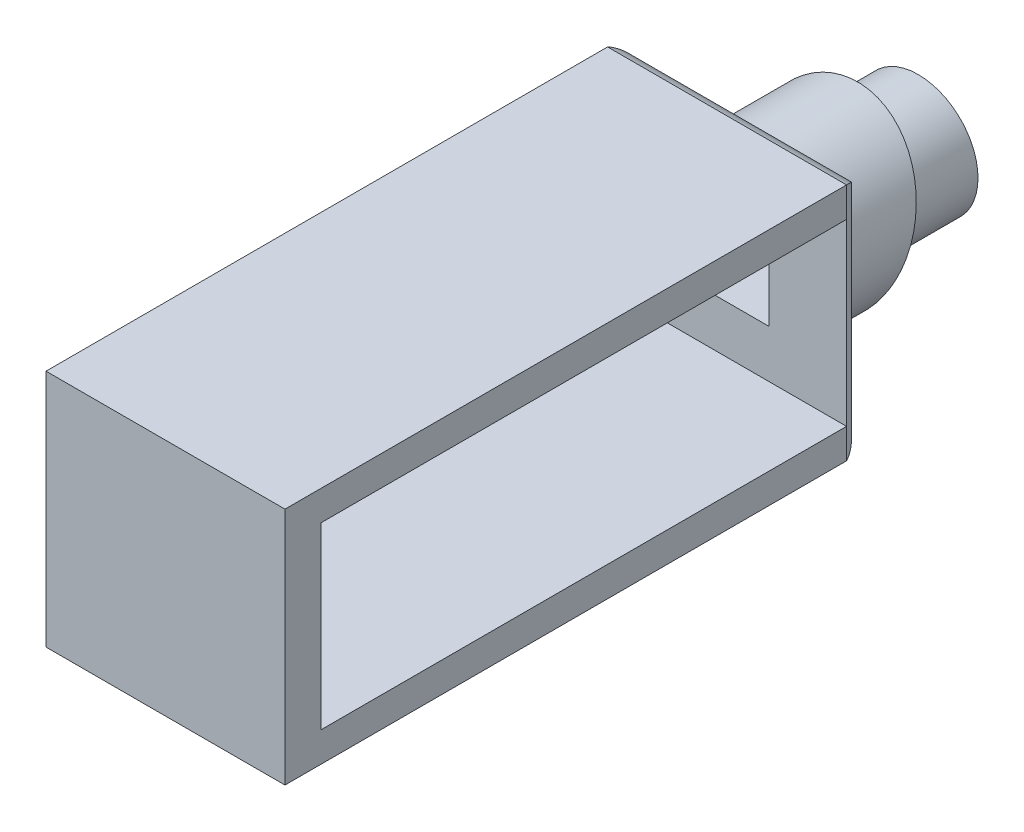
ISO-10303-21;
HEADER;
FILE_DESCRIPTION(('STEP AP214'),'2;1');
FILE_NAME('part.step','',(''),(''),'','','');
FILE_SCHEMA(('AUTOMOTIVE_DESIGN { 1 0 10303 214 1 1 1 1 }'));
ENDSEC;
DATA;
#1=APPLICATION_CONTEXT('core data for automotive mechanical design processes');
#2=APPLICATION_PROTOCOL_DEFINITION('international standard','automotive_design',2000,#1);
#3=PRODUCT_CONTEXT('',#1,'mechanical');
#4=PRODUCT('Part','Part','',(#3));
#5=PRODUCT_RELATED_PRODUCT_CATEGORY('part','',(#4));
#6=PRODUCT_DEFINITION_FORMATION('','',#4);
#7=PRODUCT_DEFINITION_CONTEXT('part definition',#1,'design');
#8=PRODUCT_DEFINITION('design','',#6,#7);
#9=PRODUCT_DEFINITION_SHAPE('','',#8);
#10=(LENGTH_UNIT() NAMED_UNIT(*) SI_UNIT(.MILLI.,.METRE.));
#11=(NAMED_UNIT(*) PLANE_ANGLE_UNIT() SI_UNIT($,.RADIAN.));
#12=(NAMED_UNIT(*) SI_UNIT($,.STERADIAN.) SOLID_ANGLE_UNIT());
#13=UNCERTAINTY_MEASURE_WITH_UNIT(LENGTH_MEASURE(1.E-05),#10,'distance_accuracy_value','');
#14=(GEOMETRIC_REPRESENTATION_CONTEXT(3) GLOBAL_UNCERTAINTY_ASSIGNED_CONTEXT((#13)) GLOBAL_UNIT_ASSIGNED_CONTEXT((#10,
#11,#12)) REPRESENTATION_CONTEXT('',''));
#15=CARTESIAN_POINT('',(0.,0.,0.));
#16=DIRECTION('',(0.,0.,1.));
#17=DIRECTION('',(1.,0.,0.));
#18=AXIS2_PLACEMENT_3D('',#15,#16,#17);
#19=CARTESIAN_POINT('',(0.,0.,0.));
#20=DIRECTION('',(0.,0.,1.));
#21=DIRECTION('',(1.,0.,0.));
#22=AXIS2_PLACEMENT_3D('',#19,#20,#21);
#23=PLANE('',#22);
#24=CARTESIAN_POINT('',(0.,0.,0.));
#25=DIRECTION('',(0.,0.,1.));
#26=DIRECTION('',(1.,0.,0.));
#27=AXIS2_PLACEMENT_3D('',#24,#25,#26);
#28=CIRCLE('',#27,2.5);
#29=CARTESIAN_POINT('',(2.5,0.,0.));
#30=VERTEX_POINT('',#29);
#31=EDGE_CURVE('E262',#30,#30,#28,.T.);
#32=ORIENTED_EDGE('',*,*,#31,.F.);
#33=EDGE_LOOP('',(#32));
#34=FACE_BOUND('',#33,.T.);
#35=CARTESIAN_POINT('',(0.,0.,0.));
#36=DIRECTION('',(0.,0.,1.));
#37=DIRECTION('',(1.,0.,0.));
#38=AXIS2_PLACEMENT_3D('',#35,#36,#37);
#39=CIRCLE('',#38,1.8);
#40=CARTESIAN_POINT('',(1.8,0.,0.));
#41=VERTEX_POINT('',#40);
#42=EDGE_CURVE('E259',#41,#41,#39,.T.);
#43=ORIENTED_EDGE('',*,*,#42,.T.);
#44=EDGE_LOOP('',(#43));
#45=FACE_BOUND('',#44,.T.);
#46=ADVANCED_FACE('F33',(#34,#45),#23,.F.);
#47=CARTESIAN_POINT('',(0.,0.,7.));
#48=DIRECTION('',(0.,0.,-1.));
#49=DIRECTION('',(-1.,0.,0.));
#50=AXIS2_PLACEMENT_3D('',#47,#48,#49);
#51=CYLINDRICAL_SURFACE('',#50,2.5);
#52=CARTESIAN_POINT('',(0.,0.,3.80746668257225));
#53=DIRECTION('',(0.,-0.342020143325676,-0.939692620785906));
#54=DIRECTION('',(0.,0.939692620785906,-0.342020143325676));
#55=AXIS2_PLACEMENT_3D('',#52,#53,#54);
#56=ELLIPSE('',#55,2.66044443118979,2.5);
#57=CARTESIAN_POINT('',(0.,2.5,2.89754109690673));
#58=VERTEX_POINT('',#57);
#59=EDGE_CURVE('E256',#58,#58,#56,.T.);
#60=ORIENTED_EDGE('',*,*,#59,.T.);
#61=EDGE_LOOP('',(#60));
#62=FACE_BOUND('',#61,.T.);
#63=ORIENTED_EDGE('',*,*,#31,.T.);
#64=EDGE_LOOP('',(#63));
#65=FACE_BOUND('',#64,.T.);
#66=ADVANCED_FACE('F315',(#62,#65),#51,.T.);
#67=CARTESIAN_POINT('',(0.,0.,7.));
#68=DIRECTION('',(0.,0.,-1.));
#69=DIRECTION('',(-1.,0.,0.));
#70=AXIS2_PLACEMENT_3D('',#67,#68,#69);
#71=CYLINDRICAL_SURFACE('',#70,1.8);
#72=CARTESIAN_POINT('',(0.,0.,3.80746668257225));
#73=DIRECTION('',(0.,-0.342020143325676,-0.939692620785906));
#74=DIRECTION('',(0.,0.939692620785906,-0.342020143325676));
#75=AXIS2_PLACEMENT_3D('',#72,#73,#74);
#76=ELLIPSE('',#75,1.91551999045665,1.8);
#77=CARTESIAN_POINT('',(0.,1.8,3.15232026089308));
#78=VERTEX_POINT('',#77);
#79=EDGE_CURVE('E265',#78,#78,#76,.T.);
#80=ORIENTED_EDGE('',*,*,#79,.F.);
#81=EDGE_LOOP('',(#80));
#82=FACE_BOUND('',#81,.T.);
#83=ORIENTED_EDGE('',*,*,#42,.F.);
#84=EDGE_LOOP('',(#83));
#85=FACE_BOUND('',#84,.T.);
#86=ADVANCED_FACE('F321',(#82,#85),#71,.F.);
#87=CARTESIAN_POINT('',(0.,0.,-6.40969202087358));
#88=DIRECTION('',(0.,0.,1.));
#89=DIRECTION('',(1.,0.,0.));
#90=AXIS2_PLACEMENT_3D('',#87,#88,#89);
#91=CYLINDRICAL_SURFACE('',#90,1.6);
#92=CARTESIAN_POINT('',(0.,0.,5.));
#93=DIRECTION('',(0.,0.,-1.));
#94=DIRECTION('',(-1.,0.,0.));
#95=AXIS2_PLACEMENT_3D('',#92,#93,#94);
#96=CIRCLE('',#95,1.6);
#97=CARTESIAN_POINT('',(-1.6,0.,5.));
#98=VERTEX_POINT('',#97);
#99=EDGE_CURVE('E37',#98,#98,#96,.F.);
#100=ORIENTED_EDGE('',*,*,#99,.T.);
#101=EDGE_LOOP('',(#100));
#102=FACE_BOUND('',#101,.T.);
#103=CARTESIAN_POINT('',(0.,0.,3.80746668257226));
#104=DIRECTION('',(0.,-0.342020143325676,-0.939692620785906));
#105=DIRECTION('',(0.,-0.939692620785906,0.342020143325676));
#106=AXIS2_PLACEMENT_3D('',#103,#104,#105);
#107=ELLIPSE('',#106,1.70268443596146,1.6);
#108=CARTESIAN_POINT('',(0.,-1.6,4.38981905739819));
#109=VERTEX_POINT('',#108);
#110=EDGE_CURVE('E251',#109,#109,#107,.F.);
#111=ORIENTED_EDGE('',*,*,#110,.F.);
#112=EDGE_LOOP('',(#111));
#113=FACE_BOUND('',#112,.T.);
#114=ADVANCED_FACE('F357',(#102,#113),#91,.F.);
#115=CARTESIAN_POINT('',(0.,1.2236962039259,3.36207768855867));
#116=DIRECTION('',(0.,-0.342020143325676,-0.939692620785906));
#117=DIRECTION('',(0.,0.939692620785906,-0.342020143325676));
#118=AXIS2_PLACEMENT_3D('',#115,#116,#117);
#119=PLANE('',#118);
#120=ORIENTED_EDGE('',*,*,#110,.T.);
#121=EDGE_LOOP('',(#120));
#122=FACE_BOUND('',#121,.T.);
#123=ORIENTED_EDGE('',*,*,#79,.T.);
#124=EDGE_LOOP('',(#123));
#125=FACE_BOUND('',#124,.T.);
#126=ADVANCED_FACE('F355',(#122,#125),#119,.T.);
#127=CARTESIAN_POINT('',(0.,0.,-6.40969202087358));
#128=DIRECTION('',(0.,0.,1.));
#129=DIRECTION('',(1.,0.,0.));
#130=AXIS2_PLACEMENT_3D('',#127,#128,#129);
#131=CYLINDRICAL_SURFACE('',#130,3.5);
#132=CARTESIAN_POINT('',(0.,0.,7.));
#133=DIRECTION('',(0.,0.,1.));
#134=DIRECTION('',(1.,0.,0.));
#135=AXIS2_PLACEMENT_3D('',#132,#133,#134);
#136=CIRCLE('',#135,3.5);
#137=CARTESIAN_POINT('',(3.5,0.,7.));
#138=VERTEX_POINT('',#137);
#139=EDGE_CURVE('E248',#138,#138,#136,.T.);
#140=ORIENTED_EDGE('',*,*,#139,.F.);
#141=EDGE_LOOP('',(#140));
#142=FACE_BOUND('',#141,.T.);
#143=CARTESIAN_POINT('',(0.,0.,3.80746668257226));
#144=DIRECTION('',(0.,-0.342020143325676,-0.939692620785906));
#145=DIRECTION('',(0.,-0.939692620785906,0.342020143325676));
#146=AXIS2_PLACEMENT_3D('',#143,#144,#145);
#147=ELLIPSE('',#146,3.7246222036657,3.5);
#148=CARTESIAN_POINT('',(0.,-3.5,5.08136250250399));
#149=VERTEX_POINT('',#148);
#150=EDGE_CURVE('E247',#149,#149,#147,.F.);
#151=ORIENTED_EDGE('',*,*,#150,.T.);
#152=EDGE_LOOP('',(#151));
#153=FACE_BOUND('',#152,.T.);
#154=ADVANCED_FACE('F352',(#142,#153),#131,.T.);
#155=ORIENTED_EDGE('',*,*,#59,.F.);
#156=EDGE_LOOP('',(#155));
#157=FACE_BOUND('',#156,.T.);
#158=ORIENTED_EDGE('',*,*,#150,.F.);
#159=EDGE_LOOP('',(#158));
#160=FACE_BOUND('',#159,.T.);
#161=ADVANCED_FACE('F345',(#157,#160),#119,.T.);
#162=CARTESIAN_POINT('',(0.,0.,7.));
#163=DIRECTION('',(0.,0.,1.));
#164=DIRECTION('',(1.,0.,0.));
#165=AXIS2_PLACEMENT_3D('',#162,#163,#164);
#166=PLANE('',#165);
#167=DIRECTION('',(1.,0.,0.));
#168=VECTOR('',#167,1.);
#169=CARTESIAN_POINT('',(0.,-3.58578643762691,7.));
#170=LINE('',#169,#168);
#171=CARTESIAN_POINT('',(3.58578643762691,-3.58578643762691,7.));
#172=VERTEX_POINT('',#171);
#173=CARTESIAN_POINT('',(-3.5857864376269,-3.58578643762691,7.));
#174=VERTEX_POINT('',#173);
#175=EDGE_CURVE('E42',#172,#174,#170,.F.);
#176=ORIENTED_EDGE('',*,*,#175,.T.);
#177=DIRECTION('',(0.,-1.,0.));
#178=VECTOR('',#177,1.);
#179=CARTESIAN_POINT('',(-3.5857864376269,0.,7.));
#180=LINE('',#179,#178);
#181=CARTESIAN_POINT('',(-3.5857864376269,3.58578643762691,7.));
#182=VERTEX_POINT('',#181);
#183=EDGE_CURVE('E11',#174,#182,#180,.F.);
#184=ORIENTED_EDGE('',*,*,#183,.T.);
#185=DIRECTION('',(-1.,0.,0.));
#186=VECTOR('',#185,1.);
#187=CARTESIAN_POINT('',(0.,3.58578643762691,7.));
#188=LINE('',#187,#186);
#189=CARTESIAN_POINT('',(3.58578643762691,3.58578643762691,7.));
#190=VERTEX_POINT('',#189);
#191=EDGE_CURVE('E268',#182,#190,#188,.F.);
#192=ORIENTED_EDGE('',*,*,#191,.T.);
#193=DIRECTION('',(0.,1.,0.));
#194=VECTOR('',#193,1.);
#195=CARTESIAN_POINT('',(3.58578643762691,0.,7.));
#196=LINE('',#195,#194);
#197=EDGE_CURVE('E270',#190,#172,#196,.F.);
#198=ORIENTED_EDGE('',*,*,#197,.T.);
#199=EDGE_LOOP('',(#176,#184,#192,#198));
#200=FACE_BOUND('',#199,.T.);
#201=ORIENTED_EDGE('',*,*,#139,.T.);
#202=EDGE_LOOP('',(#201));
#203=FACE_BOUND('',#202,.T.);
#204=ADVANCED_FACE('F288',(#200,#203),#166,.F.);
#205=CARTESIAN_POINT('',(0.,0.,8.));
#206=DIRECTION('',(0.,0.,1.));
#207=DIRECTION('',(1.,0.,0.));
#208=AXIS2_PLACEMENT_3D('',#205,#206,#207);
#209=PLANE('',#208);
#210=DIRECTION('',(1.,0.,0.));
#211=VECTOR('',#210,1.);
#212=CARTESIAN_POINT('',(3.75,3.75,8.));
#213=LINE('',#212,#211);
#214=CARTESIAN_POINT('',(-3.75,3.75,8.));
#215=VERTEX_POINT('',#214);
#216=CARTESIAN_POINT('',(5.,3.75,8.));
#217=VERTEX_POINT('',#216);
#218=EDGE_CURVE('E50',#215,#217,#213,.T.);
#219=ORIENTED_EDGE('',*,*,#218,.F.);
#220=DIRECTION('',(0.,1.,0.));
#221=VECTOR('',#220,1.);
#222=CARTESIAN_POINT('',(-3.75,3.75,8.));
#223=LINE('',#222,#221);
#224=CARTESIAN_POINT('',(-3.75,-3.75,8.));
#225=VERTEX_POINT('',#224);
#226=EDGE_CURVE('E184',#225,#215,#223,.T.);
#227=ORIENTED_EDGE('',*,*,#226,.F.);
#228=DIRECTION('',(-1.,0.,0.));
#229=VECTOR('',#228,1.);
#230=CARTESIAN_POINT('',(3.75,-3.75,8.));
#231=LINE('',#230,#229);
#232=CARTESIAN_POINT('',(5.,-3.75,8.));
#233=VERTEX_POINT('',#232);
#234=EDGE_CURVE('E170',#233,#225,#231,.T.);
#235=ORIENTED_EDGE('',*,*,#234,.F.);
#236=DIRECTION('',(0.,1.,0.));
#237=VECTOR('',#236,1.);
#238=CARTESIAN_POINT('',(5.,-5.,8.));
#239=LINE('',#238,#237);
#240=EDGE_CURVE('E240',#233,#217,#239,.T.);
#241=ORIENTED_EDGE('',*,*,#240,.T.);
#242=EDGE_LOOP('',(#219,#227,#235,#241));
#243=FACE_BOUND('',#242,.T.);
#244=DIRECTION('',(0.,-1.,0.));
#245=VECTOR('',#244,1.);
#246=CARTESIAN_POINT('',(-1.75,1.75,8.));
#247=LINE('',#246,#245);
#248=CARTESIAN_POINT('',(-1.75,1.75,8.));
#249=VERTEX_POINT('',#248);
#250=CARTESIAN_POINT('',(-1.75,-1.75,8.));
#251=VERTEX_POINT('',#250);
#252=EDGE_CURVE('E148',#249,#251,#247,.T.);
#253=ORIENTED_EDGE('',*,*,#252,.F.);
#254=DIRECTION('',(-1.,0.,0.));
#255=VECTOR('',#254,1.);
#256=CARTESIAN_POINT('',(1.75,1.75,8.));
#257=LINE('',#256,#255);
#258=CARTESIAN_POINT('',(1.75,1.75,8.));
#259=VERTEX_POINT('',#258);
#260=EDGE_CURVE('E209',#259,#249,#257,.T.);
#261=ORIENTED_EDGE('',*,*,#260,.F.);
#262=DIRECTION('',(0.,1.,0.));
#263=VECTOR('',#262,1.);
#264=CARTESIAN_POINT('',(1.75,1.75,8.));
#265=LINE('',#264,#263);
#266=CARTESIAN_POINT('',(1.75,-1.75,8.));
#267=VERTEX_POINT('',#266);
#268=EDGE_CURVE('E223',#267,#259,#265,.T.);
#269=ORIENTED_EDGE('',*,*,#268,.F.);
#270=DIRECTION('',(1.,0.,0.));
#271=VECTOR('',#270,1.);
#272=CARTESIAN_POINT('',(1.75,-1.75,8.));
#273=LINE('',#272,#271);
#274=EDGE_CURVE('E220',#251,#267,#273,.T.);
#275=ORIENTED_EDGE('',*,*,#274,.F.);
#276=EDGE_LOOP('',(#253,#261,#269,#275));
#277=FACE_BOUND('',#276,.T.);
#278=ADVANCED_FACE('F337',(#243,#277),#209,.T.);
#279=CARTESIAN_POINT('',(3.58578643762691,-5.,8.5));
#280=DIRECTION('',(0.,1.,0.));
#281=DIRECTION('',(0.,0.,1.));
#282=AXIS2_PLACEMENT_3D('',#279,#280,#281);
#283=CYLINDRICAL_SURFACE('',#282,1.5);
#284=CARTESIAN_POINT('',(3.58578643762691,-3.58578643762691,8.5));
#285=DIRECTION('',(0.707106781186547,0.707106781186548,0.));
#286=DIRECTION('',(-0.707106781186548,0.707106781186547,0.));
#287=AXIS2_PLACEMENT_3D('',#284,#285,#286);
#288=ELLIPSE('',#287,2.12132034355964,1.5);
#289=CARTESIAN_POINT('',(5.,-5.,8.));
#290=VERTEX_POINT('',#289);
#291=EDGE_CURVE('E277',#172,#290,#288,.F.);
#292=ORIENTED_EDGE('',*,*,#291,.F.);
#293=ORIENTED_EDGE('',*,*,#197,.F.);
#294=CARTESIAN_POINT('',(3.58578643762691,3.58578643762691,8.5));
#295=DIRECTION('',(-0.707106781186548,0.707106781186547,0.));
#296=DIRECTION('',(-0.707106781186547,-0.707106781186548,0.));
#297=AXIS2_PLACEMENT_3D('',#294,#295,#296);
#298=ELLIPSE('',#297,2.12132034355964,1.5);
#299=CARTESIAN_POINT('',(5.,5.,8.));
#300=VERTEX_POINT('',#299);
#301=EDGE_CURVE('E238',#300,#190,#298,.T.);
#302=ORIENTED_EDGE('',*,*,#301,.F.);
#303=DIRECTION('',(0.,1.,0.));
#304=VECTOR('',#303,1.);
#305=CARTESIAN_POINT('',(5.,3.75,8.));
#306=LINE('',#305,#304);
#307=EDGE_CURVE('E58',#217,#300,#306,.T.);
#308=ORIENTED_EDGE('',*,*,#307,.F.);
#309=ORIENTED_EDGE('',*,*,#240,.F.);
#310=EDGE_CURVE('E241',#290,#233,#239,.T.);
#311=ORIENTED_EDGE('',*,*,#310,.F.);
#312=EDGE_LOOP('',(#292,#293,#302,#308,#309,#311));
#313=FACE_BOUND('',#312,.T.);
#314=ADVANCED_FACE('F35',(#313),#283,.T.);
#315=CARTESIAN_POINT('',(5.,3.58578643762691,8.5));
#316=DIRECTION('',(-1.,0.,0.));
#317=DIRECTION('',(0.,-1.,0.));
#318=AXIS2_PLACEMENT_3D('',#315,#316,#317);
#319=CYLINDRICAL_SURFACE('',#318,1.5);
#320=ORIENTED_EDGE('',*,*,#301,.T.);
#321=ORIENTED_EDGE('',*,*,#191,.F.);
#322=CARTESIAN_POINT('',(-3.5857864376269,3.5857864376269,8.5));
#323=DIRECTION('',(-0.707106781186547,-0.707106781186548,0.));
#324=DIRECTION('',(-0.707106781186548,0.707106781186547,0.));
#325=AXIS2_PLACEMENT_3D('',#322,#323,#324);
#326=ELLIPSE('',#325,2.12132034355964,1.5);
#327=CARTESIAN_POINT('',(-5.,5.,8.));
#328=VERTEX_POINT('',#327);
#329=EDGE_CURVE('E275',#328,#182,#326,.T.);
#330=ORIENTED_EDGE('',*,*,#329,.F.);
#331=DIRECTION('',(-1.,0.,0.));
#332=VECTOR('',#331,1.);
#333=CARTESIAN_POINT('',(5.,5.,8.));
#334=LINE('',#333,#332);
#335=EDGE_CURVE('E244',#300,#328,#334,.T.);
#336=ORIENTED_EDGE('',*,*,#335,.F.);
#337=EDGE_LOOP('',(#320,#321,#330,#336));
#338=FACE_BOUND('',#337,.T.);
#339=ADVANCED_FACE('F283',(#338),#319,.T.);
#340=CARTESIAN_POINT('',(5.,-3.5857864376269,8.5));
#341=DIRECTION('',(1.,0.,0.));
#342=DIRECTION('',(0.,1.,0.));
#343=AXIS2_PLACEMENT_3D('',#340,#341,#342);
#344=CYLINDRICAL_SURFACE('',#343,1.5);
#345=ORIENTED_EDGE('',*,*,#291,.T.);
#346=DIRECTION('',(1.,0.,0.));
#347=VECTOR('',#346,1.);
#348=CARTESIAN_POINT('',(5.,-5.,8.));
#349=LINE('',#348,#347);
#350=CARTESIAN_POINT('',(-5.,-5.,8.));
#351=VERTEX_POINT('',#350);
#352=EDGE_CURVE('E237',#351,#290,#349,.T.);
#353=ORIENTED_EDGE('',*,*,#352,.F.);
#354=CARTESIAN_POINT('',(-3.5857864376269,-3.58578643762691,8.5));
#355=DIRECTION('',(0.707106781186548,-0.707106781186547,0.));
#356=DIRECTION('',(0.707106781186547,0.707106781186548,0.));
#357=AXIS2_PLACEMENT_3D('',#354,#355,#356);
#358=ELLIPSE('',#357,2.12132034355964,1.5);
#359=EDGE_CURVE('E273',#174,#351,#358,.F.);
#360=ORIENTED_EDGE('',*,*,#359,.F.);
#361=ORIENTED_EDGE('',*,*,#175,.F.);
#362=EDGE_LOOP('',(#345,#353,#360,#361));
#363=FACE_BOUND('',#362,.T.);
#364=ADVANCED_FACE('F296',(#363),#344,.T.);
#365=CARTESIAN_POINT('',(-3.5857864376269,-5.,8.5));
#366=DIRECTION('',(0.,-1.,0.));
#367=DIRECTION('',(0.,0.,-1.));
#368=AXIS2_PLACEMENT_3D('',#365,#366,#367);
#369=CYLINDRICAL_SURFACE('',#368,1.5);
#370=ORIENTED_EDGE('',*,*,#329,.T.);
#371=ORIENTED_EDGE('',*,*,#183,.F.);
#372=ORIENTED_EDGE('',*,*,#359,.T.);
#373=DIRECTION('',(0.,-1.,0.));
#374=VECTOR('',#373,1.);
#375=CARTESIAN_POINT('',(-5.,-5.,8.));
#376=LINE('',#375,#374);
#377=EDGE_CURVE('E145',#328,#351,#376,.T.);
#378=ORIENTED_EDGE('',*,*,#377,.F.);
#379=EDGE_LOOP('',(#370,#371,#372,#378));
#380=FACE_BOUND('',#379,.T.);
#381=ADVANCED_FACE('F293',(#380),#369,.T.);
#382=CARTESIAN_POINT('',(0.,0.,5.));
#383=DIRECTION('',(0.,0.,-1.));
#384=DIRECTION('',(-1.,0.,0.));
#385=AXIS2_PLACEMENT_3D('',#382,#383,#384);
#386=PLANE('',#385);
#387=DIRECTION('',(0.,-1.,0.));
#388=VECTOR('',#387,1.);
#389=CARTESIAN_POINT('',(-1.75,1.75,5.));
#390=LINE('',#389,#388);
#391=CARTESIAN_POINT('',(-1.75,1.75,5.));
#392=VERTEX_POINT('',#391);
#393=CARTESIAN_POINT('',(-1.75,-1.75,5.));
#394=VERTEX_POINT('',#393);
#395=EDGE_CURVE('E205',#392,#394,#390,.T.);
#396=ORIENTED_EDGE('',*,*,#395,.T.);
#397=DIRECTION('',(1.,0.,0.));
#398=VECTOR('',#397,1.);
#399=CARTESIAN_POINT('',(1.75,-1.75,5.));
#400=LINE('',#399,#398);
#401=CARTESIAN_POINT('',(1.75,-1.75,5.));
#402=VERTEX_POINT('',#401);
#403=EDGE_CURVE('E208',#394,#402,#400,.T.);
#404=ORIENTED_EDGE('',*,*,#403,.T.);
#405=DIRECTION('',(0.,1.,0.));
#406=VECTOR('',#405,1.);
#407=CARTESIAN_POINT('',(1.75,1.75,5.));
#408=LINE('',#407,#406);
#409=CARTESIAN_POINT('',(1.75,1.75,5.));
#410=VERTEX_POINT('',#409);
#411=EDGE_CURVE('E212',#402,#410,#408,.T.);
#412=ORIENTED_EDGE('',*,*,#411,.T.);
#413=DIRECTION('',(-1.,0.,0.));
#414=VECTOR('',#413,1.);
#415=CARTESIAN_POINT('',(1.75,1.75,5.));
#416=LINE('',#415,#414);
#417=EDGE_CURVE('E215',#410,#392,#416,.T.);
#418=ORIENTED_EDGE('',*,*,#417,.T.);
#419=EDGE_LOOP('',(#396,#404,#412,#418));
#420=FACE_BOUND('',#419,.T.);
#421=ORIENTED_EDGE('',*,*,#99,.F.);
#422=EDGE_LOOP('',(#421));
#423=FACE_BOUND('',#422,.T.);
#424=ADVANCED_FACE('F331',(#420,#423),#386,.F.);
#425=CARTESIAN_POINT('',(-1.75,1.75,5.));
#426=DIRECTION('',(-1.,0.,0.));
#427=DIRECTION('',(0.,-1.,0.));
#428=AXIS2_PLACEMENT_3D('',#425,#426,#427);
#429=PLANE('',#428);
#430=ORIENTED_EDGE('',*,*,#252,.T.);
#431=DIRECTION('',(0.,0.,1.));
#432=VECTOR('',#431,1.);
#433=CARTESIAN_POINT('',(-1.75,-1.75,5.));
#434=LINE('',#433,#432);
#435=EDGE_CURVE('E218',#394,#251,#434,.T.);
#436=ORIENTED_EDGE('',*,*,#435,.F.);
#437=ORIENTED_EDGE('',*,*,#395,.F.);
#438=DIRECTION('',(0.,0.,1.));
#439=VECTOR('',#438,1.);
#440=CARTESIAN_POINT('',(-1.75,1.75,5.));
#441=LINE('',#440,#439);
#442=EDGE_CURVE('E228',#392,#249,#441,.T.);
#443=ORIENTED_EDGE('',*,*,#442,.T.);
#444=EDGE_LOOP('',(#430,#436,#437,#443));
#445=FACE_BOUND('',#444,.T.);
#446=ADVANCED_FACE('F349',(#445),#429,.F.);
#447=CARTESIAN_POINT('',(1.75,1.75,5.));
#448=DIRECTION('',(0.,1.,0.));
#449=DIRECTION('',(-1.,0.,0.));
#450=AXIS2_PLACEMENT_3D('',#447,#448,#449);
#451=PLANE('',#450);
#452=ORIENTED_EDGE('',*,*,#260,.T.);
#453=ORIENTED_EDGE('',*,*,#442,.F.);
#454=ORIENTED_EDGE('',*,*,#417,.F.);
#455=DIRECTION('',(0.,0.,1.));
#456=VECTOR('',#455,1.);
#457=CARTESIAN_POINT('',(1.75,1.75,5.));
#458=LINE('',#457,#456);
#459=EDGE_CURVE('E230',#410,#259,#458,.T.);
#460=ORIENTED_EDGE('',*,*,#459,.T.);
#461=EDGE_LOOP('',(#452,#453,#454,#460));
#462=FACE_BOUND('',#461,.T.);
#463=ADVANCED_FACE('F408',(#462),#451,.F.);
#464=CARTESIAN_POINT('',(1.75,1.75,5.));
#465=DIRECTION('',(1.,0.,0.));
#466=DIRECTION('',(0.,1.,0.));
#467=AXIS2_PLACEMENT_3D('',#464,#465,#466);
#468=PLANE('',#467);
#469=ORIENTED_EDGE('',*,*,#268,.T.);
#470=ORIENTED_EDGE('',*,*,#459,.F.);
#471=ORIENTED_EDGE('',*,*,#411,.F.);
#472=DIRECTION('',(0.,0.,1.));
#473=VECTOR('',#472,1.);
#474=CARTESIAN_POINT('',(1.75,-1.75,5.));
#475=LINE('',#474,#473);
#476=EDGE_CURVE('E232',#402,#267,#475,.T.);
#477=ORIENTED_EDGE('',*,*,#476,.T.);
#478=EDGE_LOOP('',(#469,#470,#471,#477));
#479=FACE_BOUND('',#478,.T.);
#480=ADVANCED_FACE('F417',(#479),#468,.F.);
#481=CARTESIAN_POINT('',(1.75,-1.75,5.));
#482=DIRECTION('',(0.,-1.,0.));
#483=DIRECTION('',(1.,0.,0.));
#484=AXIS2_PLACEMENT_3D('',#481,#482,#483);
#485=PLANE('',#484);
#486=ORIENTED_EDGE('',*,*,#274,.T.);
#487=ORIENTED_EDGE('',*,*,#476,.F.);
#488=ORIENTED_EDGE('',*,*,#403,.F.);
#489=ORIENTED_EDGE('',*,*,#435,.T.);
#490=EDGE_LOOP('',(#486,#487,#488,#489));
#491=FACE_BOUND('',#490,.T.);
#492=ADVANCED_FACE('F427',(#491),#485,.F.);
#493=CARTESIAN_POINT('',(-5.,5.,30.));
#494=DIRECTION('',(1.,0.,0.));
#495=DIRECTION('',(0.,0.,-1.));
#496=AXIS2_PLACEMENT_3D('',#493,#494,#495);
#497=PLANE('',#496);
#498=ORIENTED_EDGE('',*,*,#377,.T.);
#499=DIRECTION('',(0.,0.,-1.));
#500=VECTOR('',#499,1.);
#501=CARTESIAN_POINT('',(-5.,-5.,30.));
#502=LINE('',#501,#500);
#503=CARTESIAN_POINT('',(-5.,-5.,31.5));
#504=VERTEX_POINT('',#503);
#505=EDGE_CURVE('E138',#504,#351,#502,.T.);
#506=ORIENTED_EDGE('',*,*,#505,.F.);
#507=DIRECTION('',(0.,-1.,0.));
#508=VECTOR('',#507,1.);
#509=CARTESIAN_POINT('',(-5.,5.,31.5));
#510=LINE('',#509,#508);
#511=CARTESIAN_POINT('',(-5.,5.,31.5));
#512=VERTEX_POINT('',#511);
#513=EDGE_CURVE('E143',#512,#504,#510,.T.);
#514=ORIENTED_EDGE('',*,*,#513,.F.);
#515=DIRECTION('',(0.,0.,-1.));
#516=VECTOR('',#515,1.);
#517=CARTESIAN_POINT('',(-5.,5.,30.));
#518=LINE('',#517,#516);
#519=EDGE_CURVE('E181',#512,#328,#518,.T.);
#520=ORIENTED_EDGE('',*,*,#519,.T.);
#521=EDGE_LOOP('',(#498,#506,#514,#520));
#522=FACE_BOUND('',#521,.T.);
#523=ADVANCED_FACE('F140',(#522),#497,.F.);
#524=CARTESIAN_POINT('',(5.,-5.,30.));
#525=DIRECTION('',(0.,1.,0.));
#526=DIRECTION('',(0.,0.,1.));
#527=AXIS2_PLACEMENT_3D('',#524,#525,#526);
#528=PLANE('',#527);
#529=ORIENTED_EDGE('',*,*,#352,.T.);
#530=DIRECTION('',(0.,0.,-1.));
#531=VECTOR('',#530,1.);
#532=CARTESIAN_POINT('',(5.,-5.,30.));
#533=LINE('',#532,#531);
#534=CARTESIAN_POINT('',(5.,-5.,31.5));
#535=VERTEX_POINT('',#534);
#536=EDGE_CURVE('E149',#535,#290,#533,.T.);
#537=ORIENTED_EDGE('',*,*,#536,.F.);
#538=DIRECTION('',(1.,0.,0.));
#539=VECTOR('',#538,1.);
#540=CARTESIAN_POINT('',(5.,-5.,31.5));
#541=LINE('',#540,#539);
#542=EDGE_CURVE('E152',#504,#535,#541,.T.);
#543=ORIENTED_EDGE('',*,*,#542,.F.);
#544=ORIENTED_EDGE('',*,*,#505,.T.);
#545=EDGE_LOOP('',(#529,#537,#543,#544));
#546=FACE_BOUND('',#545,.T.);
#547=ADVANCED_FACE('F153',(#546),#528,.F.);
#548=CARTESIAN_POINT('',(5.,-3.75,30.));
#549=DIRECTION('',(-1.,0.,0.));
#550=DIRECTION('',(0.,-1.,0.));
#551=AXIS2_PLACEMENT_3D('',#548,#549,#550);
#552=PLANE('',#551);
#553=ORIENTED_EDGE('',*,*,#310,.T.);
#554=DIRECTION('',(0.,0.,-1.));
#555=VECTOR('',#554,1.);
#556=CARTESIAN_POINT('',(5.,-3.75,30.));
#557=LINE('',#556,#555);
#558=CARTESIAN_POINT('',(5.,-3.75,30.));
#559=VERTEX_POINT('',#558);
#560=EDGE_CURVE('E201',#559,#233,#557,.T.);
#561=ORIENTED_EDGE('',*,*,#560,.F.);
#562=DIRECTION('',(0.,1.,0.));
#563=VECTOR('',#562,1.);
#564=CARTESIAN_POINT('',(5.,5.,30.));
#565=LINE('',#564,#563);
#566=CARTESIAN_POINT('',(5.,3.75,30.));
#567=VERTEX_POINT('',#566);
#568=EDGE_CURVE('E164',#559,#567,#565,.T.);
#569=ORIENTED_EDGE('',*,*,#568,.T.);
#570=DIRECTION('',(0.,0.,-1.));
#571=VECTOR('',#570,1.);
#572=CARTESIAN_POINT('',(5.,3.75,30.));
#573=LINE('',#572,#571);
#574=EDGE_CURVE('E192',#567,#217,#573,.T.);
#575=ORIENTED_EDGE('',*,*,#574,.T.);
#576=ORIENTED_EDGE('',*,*,#307,.T.);
#577=DIRECTION('',(0.,0.,-1.));
#578=VECTOR('',#577,1.);
#579=CARTESIAN_POINT('',(5.,5.,30.));
#580=LINE('',#579,#578);
#581=CARTESIAN_POINT('',(5.,5.,31.5));
#582=VERTEX_POINT('',#581);
#583=EDGE_CURVE('E189',#582,#300,#580,.T.);
#584=ORIENTED_EDGE('',*,*,#583,.F.);
#585=DIRECTION('',(0.,1.,0.));
#586=VECTOR('',#585,1.);
#587=CARTESIAN_POINT('',(5.,5.,31.5));
#588=LINE('',#587,#586);
#589=EDGE_CURVE('E158',#535,#582,#588,.T.);
#590=ORIENTED_EDGE('',*,*,#589,.F.);
#591=ORIENTED_EDGE('',*,*,#536,.T.);
#592=EDGE_LOOP('',(#553,#561,#569,#575,#576,#584,#590,#591));
#593=FACE_BOUND('',#592,.T.);
#594=ADVANCED_FACE('F298',(#593),#552,.F.);
#595=CARTESIAN_POINT('',(3.75,-3.75,30.));
#596=DIRECTION('',(0.,-1.,0.));
#597=DIRECTION('',(0.,0.,-1.));
#598=AXIS2_PLACEMENT_3D('',#595,#596,#597);
#599=PLANE('',#598);
#600=ORIENTED_EDGE('',*,*,#234,.T.);
#601=DIRECTION('',(0.,0.,-1.));
#602=VECTOR('',#601,1.);
#603=CARTESIAN_POINT('',(-3.75,-3.75,30.));
#604=LINE('',#603,#602);
#605=CARTESIAN_POINT('',(-3.75,-3.75,30.));
#606=VERTEX_POINT('',#605);
#607=EDGE_CURVE('E198',#606,#225,#604,.T.);
#608=ORIENTED_EDGE('',*,*,#607,.F.);
#609=DIRECTION('',(-1.,0.,0.));
#610=VECTOR('',#609,1.);
#611=CARTESIAN_POINT('',(3.75,-3.75,30.));
#612=LINE('',#611,#610);
#613=EDGE_CURVE('E172',#559,#606,#612,.T.);
#614=ORIENTED_EDGE('',*,*,#613,.F.);
#615=ORIENTED_EDGE('',*,*,#560,.T.);
#616=EDGE_LOOP('',(#600,#608,#614,#615));
#617=FACE_BOUND('',#616,.T.);
#618=ADVANCED_FACE('F487',(#617),#599,.F.);
#619=CARTESIAN_POINT('',(-3.75,3.75,30.));
#620=DIRECTION('',(-1.,0.,0.));
#621=DIRECTION('',(0.,0.,1.));
#622=AXIS2_PLACEMENT_3D('',#619,#620,#621);
#623=PLANE('',#622);
#624=ORIENTED_EDGE('',*,*,#226,.T.);
#625=DIRECTION('',(0.,0.,-1.));
#626=VECTOR('',#625,1.);
#627=CARTESIAN_POINT('',(-3.75,3.75,30.));
#628=LINE('',#627,#626);
#629=CARTESIAN_POINT('',(-3.75,3.75,30.));
#630=VERTEX_POINT('',#629);
#631=EDGE_CURVE('E195',#630,#215,#628,.T.);
#632=ORIENTED_EDGE('',*,*,#631,.F.);
#633=DIRECTION('',(0.,1.,0.));
#634=VECTOR('',#633,1.);
#635=CARTESIAN_POINT('',(-3.75,3.75,30.));
#636=LINE('',#635,#634);
#637=EDGE_CURVE('E175',#606,#630,#636,.T.);
#638=ORIENTED_EDGE('',*,*,#637,.F.);
#639=ORIENTED_EDGE('',*,*,#607,.T.);
#640=EDGE_LOOP('',(#624,#632,#638,#639));
#641=FACE_BOUND('',#640,.T.);
#642=ADVANCED_FACE('F310',(#641),#623,.F.);
#643=CARTESIAN_POINT('',(3.75,3.75,30.));
#644=DIRECTION('',(0.,1.,0.));
#645=DIRECTION('',(0.,0.,1.));
#646=AXIS2_PLACEMENT_3D('',#643,#644,#645);
#647=PLANE('',#646);
#648=ORIENTED_EDGE('',*,*,#218,.T.);
#649=ORIENTED_EDGE('',*,*,#574,.F.);
#650=DIRECTION('',(1.,0.,0.));
#651=VECTOR('',#650,1.);
#652=CARTESIAN_POINT('',(3.75,3.75,30.));
#653=LINE('',#652,#651);
#654=EDGE_CURVE('E178',#630,#567,#653,.T.);
#655=ORIENTED_EDGE('',*,*,#654,.F.);
#656=ORIENTED_EDGE('',*,*,#631,.T.);
#657=EDGE_LOOP('',(#648,#649,#655,#656));
#658=FACE_BOUND('',#657,.T.);
#659=ADVANCED_FACE('F302',(#658),#647,.F.);
#660=CARTESIAN_POINT('',(3.75,5.,30.));
#661=DIRECTION('',(0.,-1.,0.));
#662=DIRECTION('',(0.,0.,-1.));
#663=AXIS2_PLACEMENT_3D('',#660,#661,#662);
#664=PLANE('',#663);
#665=ORIENTED_EDGE('',*,*,#335,.T.);
#666=ORIENTED_EDGE('',*,*,#519,.F.);
#667=DIRECTION('',(-1.,0.,0.));
#668=VECTOR('',#667,1.);
#669=CARTESIAN_POINT('',(5.,5.,31.5));
#670=LINE('',#669,#668);
#671=EDGE_CURVE('E163',#582,#512,#670,.T.);
#672=ORIENTED_EDGE('',*,*,#671,.F.);
#673=ORIENTED_EDGE('',*,*,#583,.T.);
#674=EDGE_LOOP('',(#665,#666,#672,#673));
#675=FACE_BOUND('',#674,.T.);
#676=ADVANCED_FACE('F300',(#675),#664,.F.);
#677=CARTESIAN_POINT('',(0.,0.,31.5));
#678=DIRECTION('',(0.,0.,-1.));
#679=DIRECTION('',(-1.,0.,0.));
#680=AXIS2_PLACEMENT_3D('',#677,#678,#679);
#681=PLANE('',#680);
#682=ORIENTED_EDGE('',*,*,#513,.T.);
#683=ORIENTED_EDGE('',*,*,#542,.T.);
#684=ORIENTED_EDGE('',*,*,#589,.T.);
#685=ORIENTED_EDGE('',*,*,#671,.T.);
#686=EDGE_LOOP('',(#682,#683,#684,#685));
#687=FACE_BOUND('',#686,.T.);
#688=ADVANCED_FACE('F161',(#687),#681,.F.);
#689=CARTESIAN_POINT('',(0.,0.,30.));
#690=DIRECTION('',(0.,0.,-1.));
#691=DIRECTION('',(-1.,0.,0.));
#692=AXIS2_PLACEMENT_3D('',#689,#690,#691);
#693=PLANE('',#692);
#694=ORIENTED_EDGE('',*,*,#568,.F.);
#695=ORIENTED_EDGE('',*,*,#613,.T.);
#696=ORIENTED_EDGE('',*,*,#637,.T.);
#697=ORIENTED_EDGE('',*,*,#654,.T.);
#698=EDGE_LOOP('',(#694,#695,#696,#697));
#699=FACE_BOUND('',#698,.T.);
#700=ADVANCED_FACE('F308',(#699),#693,.T.);
#701=CLOSED_SHELL('',(#46,#66,#86,#114,#126,#154,#161,#204,#278,#314,#339,#364,#381,#424,#446,
#463,#480,#492,#523,#547,#594,#618,#642,#659,#676,#688,#700));
#702=MANIFOLD_SOLID_BREP('B2',#701);
#703=ADVANCED_BREP_SHAPE_REPRESENTATION('',(#18,#702),#14);
#704=SHAPE_DEFINITION_REPRESENTATION(#9,#703);
ENDSEC;
END-ISO-10303-21;
